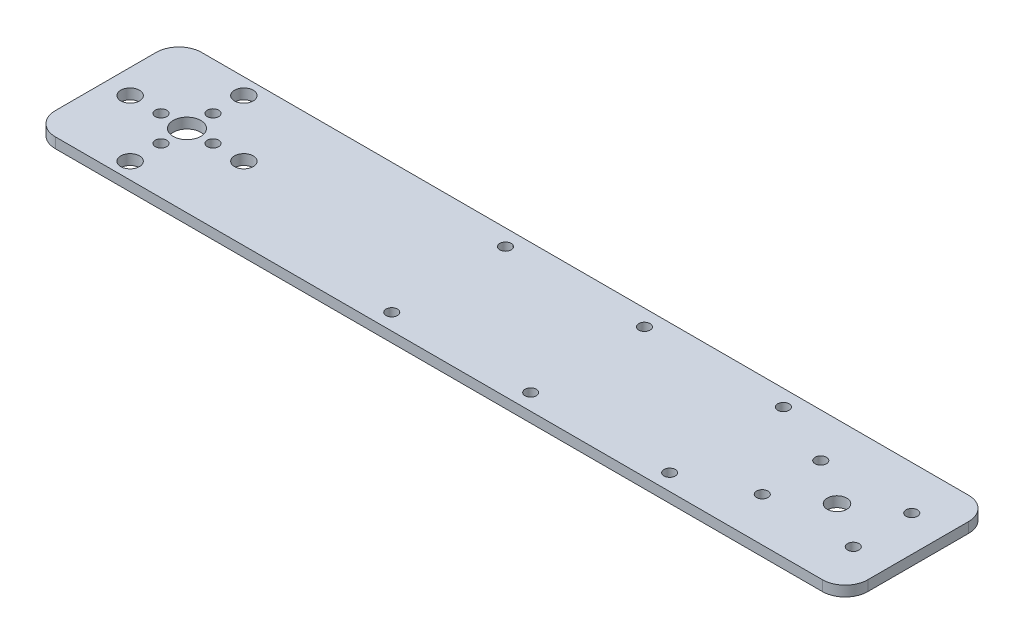
ISO-10303-21;
HEADER;
FILE_DESCRIPTION(('STEP AP214'),'2;1');
FILE_NAME('part.step','',(''),(''),'','','');
FILE_SCHEMA(('AUTOMOTIVE_DESIGN { 1 0 10303 214 1 1 1 1 }'));
ENDSEC;
DATA;
#1=APPLICATION_CONTEXT('core data for automotive mechanical design processes');
#2=APPLICATION_PROTOCOL_DEFINITION('international standard','automotive_design',2000,#1);
#3=PRODUCT_CONTEXT('',#1,'mechanical');
#4=PRODUCT('Part','Part','',(#3));
#5=PRODUCT_RELATED_PRODUCT_CATEGORY('part','',(#4));
#6=PRODUCT_DEFINITION_FORMATION('','',#4);
#7=PRODUCT_DEFINITION_CONTEXT('part definition',#1,'design');
#8=PRODUCT_DEFINITION('design','',#6,#7);
#9=PRODUCT_DEFINITION_SHAPE('','',#8);
#10=(LENGTH_UNIT() NAMED_UNIT(*) SI_UNIT(.MILLI.,.METRE.));
#11=(NAMED_UNIT(*) PLANE_ANGLE_UNIT() SI_UNIT($,.RADIAN.));
#12=(NAMED_UNIT(*) SI_UNIT($,.STERADIAN.) SOLID_ANGLE_UNIT());
#13=UNCERTAINTY_MEASURE_WITH_UNIT(LENGTH_MEASURE(1.E-05),#10,'distance_accuracy_value','');
#14=(GEOMETRIC_REPRESENTATION_CONTEXT(3) GLOBAL_UNCERTAINTY_ASSIGNED_CONTEXT((#13)) GLOBAL_UNIT_ASSIGNED_CONTEXT((#10,
#11,#12)) REPRESENTATION_CONTEXT('',''));
#15=CARTESIAN_POINT('',(0.,0.,0.));
#16=DIRECTION('',(0.,0.,1.));
#17=DIRECTION('',(1.,0.,0.));
#18=AXIS2_PLACEMENT_3D('',#15,#16,#17);
#19=CARTESIAN_POINT('',(-25.,3.175,-22.5));
#20=DIRECTION('',(1.,0.,0.));
#21=DIRECTION('',(0.,0.,-1.));
#22=AXIS2_PLACEMENT_3D('',#19,#20,#21);
#23=PLANE('',#22);
#24=DIRECTION('',(0.,0.,1.));
#25=VECTOR('',#24,1.);
#26=CARTESIAN_POINT('',(-25.,0.,-22.5));
#27=LINE('',#26,#25);
#28=CARTESIAN_POINT('',(-25.,0.,-15.5));
#29=VERTEX_POINT('',#28);
#30=CARTESIAN_POINT('',(-25.,0.,15.5));
#31=VERTEX_POINT('',#30);
#32=EDGE_CURVE('E132',#29,#31,#27,.T.);
#33=ORIENTED_EDGE('',*,*,#32,.T.);
#34=DIRECTION('',(0.,-1.,0.));
#35=VECTOR('',#34,1.);
#36=CARTESIAN_POINT('',(-25.,3.175,15.5));
#37=LINE('',#36,#35);
#38=CARTESIAN_POINT('',(-25.,3.175,15.5));
#39=VERTEX_POINT('',#38);
#40=EDGE_CURVE('E110',#31,#39,#37,.F.);
#41=ORIENTED_EDGE('',*,*,#40,.T.);
#42=DIRECTION('',(0.,0.,1.));
#43=VECTOR('',#42,1.);
#44=CARTESIAN_POINT('',(-25.,3.175,-22.5));
#45=LINE('',#44,#43);
#46=CARTESIAN_POINT('',(-25.,3.175,-15.5));
#47=VERTEX_POINT('',#46);
#48=EDGE_CURVE('E142',#47,#39,#45,.T.);
#49=ORIENTED_EDGE('',*,*,#48,.F.);
#50=DIRECTION('',(0.,-1.,0.));
#51=VECTOR('',#50,1.);
#52=CARTESIAN_POINT('',(-25.,3.175,-15.5));
#53=LINE('',#52,#51);
#54=EDGE_CURVE('E115',#47,#29,#53,.T.);
#55=ORIENTED_EDGE('',*,*,#54,.T.);
#56=EDGE_LOOP('',(#33,#41,#49,#55));
#57=FACE_BOUND('',#56,.T.);
#58=ADVANCED_FACE('F39',(#57),#23,.F.);
#59=CARTESIAN_POINT('',(-25.,3.175,22.5));
#60=DIRECTION('',(0.,0.,-1.));
#61=DIRECTION('',(-1.,0.,0.));
#62=AXIS2_PLACEMENT_3D('',#59,#60,#61);
#63=PLANE('',#62);
#64=DIRECTION('',(1.,0.,0.));
#65=VECTOR('',#64,1.);
#66=CARTESIAN_POINT('',(-25.,3.175,22.5));
#67=LINE('',#66,#65);
#68=CARTESIAN_POINT('',(-18.,3.175,22.5));
#69=VERTEX_POINT('',#68);
#70=CARTESIAN_POINT('',(218.,3.175,22.5));
#71=VERTEX_POINT('',#70);
#72=EDGE_CURVE('E125',#69,#71,#67,.T.);
#73=ORIENTED_EDGE('',*,*,#72,.F.);
#74=DIRECTION('',(0.,-1.,0.));
#75=VECTOR('',#74,1.);
#76=CARTESIAN_POINT('',(-18.,3.175,22.5));
#77=LINE('',#76,#75);
#78=CARTESIAN_POINT('',(-18.,0.,22.5));
#79=VERTEX_POINT('',#78);
#80=EDGE_CURVE('E109',#69,#79,#77,.T.);
#81=ORIENTED_EDGE('',*,*,#80,.T.);
#82=DIRECTION('',(1.,0.,0.));
#83=VECTOR('',#82,1.);
#84=CARTESIAN_POINT('',(-25.,0.,22.5));
#85=LINE('',#84,#83);
#86=CARTESIAN_POINT('',(218.,0.,22.5));
#87=VERTEX_POINT('',#86);
#88=EDGE_CURVE('E122',#79,#87,#85,.T.);
#89=ORIENTED_EDGE('',*,*,#88,.T.);
#90=DIRECTION('',(0.,-1.,0.));
#91=VECTOR('',#90,1.);
#92=CARTESIAN_POINT('',(218.,3.175,22.5));
#93=LINE('',#92,#91);
#94=EDGE_CURVE('E127',#87,#71,#93,.F.);
#95=ORIENTED_EDGE('',*,*,#94,.T.);
#96=EDGE_LOOP('',(#73,#81,#89,#95));
#97=FACE_BOUND('',#96,.T.);
#98=ADVANCED_FACE('F121',(#97),#63,.F.);
#99=CARTESIAN_POINT('',(225.,3.175,-22.5));
#100=DIRECTION('',(-1.,0.,0.));
#101=DIRECTION('',(0.,0.,1.));
#102=AXIS2_PLACEMENT_3D('',#99,#100,#101);
#103=PLANE('',#102);
#104=DIRECTION('',(0.,0.,-1.));
#105=VECTOR('',#104,1.);
#106=CARTESIAN_POINT('',(225.,0.,-22.5));
#107=LINE('',#106,#105);
#108=CARTESIAN_POINT('',(225.,0.,15.5));
#109=VERTEX_POINT('',#108);
#110=CARTESIAN_POINT('',(225.,0.,-15.5));
#111=VERTEX_POINT('',#110);
#112=EDGE_CURVE('E131',#109,#111,#107,.T.);
#113=ORIENTED_EDGE('',*,*,#112,.T.);
#114=DIRECTION('',(0.,-1.,0.));
#115=VECTOR('',#114,1.);
#116=CARTESIAN_POINT('',(225.,3.175,-15.5));
#117=LINE('',#116,#115);
#118=CARTESIAN_POINT('',(225.,3.175,-15.5));
#119=VERTEX_POINT('',#118);
#120=EDGE_CURVE('E11',#111,#119,#117,.F.);
#121=ORIENTED_EDGE('',*,*,#120,.T.);
#122=DIRECTION('',(0.,0.,-1.));
#123=VECTOR('',#122,1.);
#124=CARTESIAN_POINT('',(225.,3.175,-22.5));
#125=LINE('',#124,#123);
#126=CARTESIAN_POINT('',(225.,3.175,15.5));
#127=VERTEX_POINT('',#126);
#128=EDGE_CURVE('E168',#127,#119,#125,.T.);
#129=ORIENTED_EDGE('',*,*,#128,.F.);
#130=DIRECTION('',(0.,-1.,0.));
#131=VECTOR('',#130,1.);
#132=CARTESIAN_POINT('',(225.,3.175,15.5));
#133=LINE('',#132,#131);
#134=EDGE_CURVE('E47',#127,#109,#133,.T.);
#135=ORIENTED_EDGE('',*,*,#134,.T.);
#136=EDGE_LOOP('',(#113,#121,#129,#135));
#137=FACE_BOUND('',#136,.T.);
#138=ADVANCED_FACE('F166',(#137),#103,.F.);
#139=CARTESIAN_POINT('',(-25.,3.175,-22.5));
#140=DIRECTION('',(0.,0.,1.));
#141=DIRECTION('',(1.,0.,0.));
#142=AXIS2_PLACEMENT_3D('',#139,#140,#141);
#143=PLANE('',#142);
#144=DIRECTION('',(-1.,0.,0.));
#145=VECTOR('',#144,1.);
#146=CARTESIAN_POINT('',(-25.,0.,-22.5));
#147=LINE('',#146,#145);
#148=CARTESIAN_POINT('',(218.,0.,-22.5));
#149=VERTEX_POINT('',#148);
#150=CARTESIAN_POINT('',(-18.,0.,-22.5));
#151=VERTEX_POINT('',#150);
#152=EDGE_CURVE('E135',#149,#151,#147,.T.);
#153=ORIENTED_EDGE('',*,*,#152,.T.);
#154=DIRECTION('',(0.,-1.,0.));
#155=VECTOR('',#154,1.);
#156=CARTESIAN_POINT('',(-18.,3.175,-22.5));
#157=LINE('',#156,#155);
#158=CARTESIAN_POINT('',(-18.,3.175,-22.5));
#159=VERTEX_POINT('',#158);
#160=EDGE_CURVE('E54',#151,#159,#157,.F.);
#161=ORIENTED_EDGE('',*,*,#160,.T.);
#162=DIRECTION('',(-1.,0.,0.));
#163=VECTOR('',#162,1.);
#164=CARTESIAN_POINT('',(-25.,3.175,-22.5));
#165=LINE('',#164,#163);
#166=CARTESIAN_POINT('',(218.,3.175,-22.5));
#167=VERTEX_POINT('',#166);
#168=EDGE_CURVE('E143',#167,#159,#165,.T.);
#169=ORIENTED_EDGE('',*,*,#168,.F.);
#170=DIRECTION('',(0.,-1.,0.));
#171=VECTOR('',#170,1.);
#172=CARTESIAN_POINT('',(218.,3.175,-22.5));
#173=LINE('',#172,#171);
#174=EDGE_CURVE('E159',#167,#149,#173,.T.);
#175=ORIENTED_EDGE('',*,*,#174,.T.);
#176=EDGE_LOOP('',(#153,#161,#169,#175));
#177=FACE_BOUND('',#176,.T.);
#178=ADVANCED_FACE('F175',(#177),#143,.F.);
#179=CARTESIAN_POINT('',(0.,3.175,0.));
#180=DIRECTION('',(0.,1.,0.));
#181=DIRECTION('',(0.,0.,1.));
#182=AXIS2_PLACEMENT_3D('',#179,#180,#181);
#183=PLANE('',#182);
#184=CARTESIAN_POINT('',(0.,3.175,-8.));
#185=DIRECTION('',(0.,1.,0.));
#186=DIRECTION('',(0.,0.,1.));
#187=AXIS2_PLACEMENT_3D('',#184,#185,#186);
#188=CIRCLE('',#187,1.75);
#189=CARTESIAN_POINT('',(0.,3.175,-6.25));
#190=VERTEX_POINT('',#189);
#191=EDGE_CURVE('E296',#190,#190,#188,.T.);
#192=ORIENTED_EDGE('',*,*,#191,.F.);
#193=EDGE_LOOP('',(#192));
#194=FACE_BOUND('',#193,.T.);
#195=CARTESIAN_POINT('',(8.00000000000012,3.175,0.));
#196=DIRECTION('',(0.,1.,0.));
#197=DIRECTION('',(0.,0.,1.));
#198=AXIS2_PLACEMENT_3D('',#195,#196,#197);
#199=CIRCLE('',#198,1.74999999999994);
#200=CARTESIAN_POINT('',(8.00000000000012,3.175,1.75));
#201=VERTEX_POINT('',#200);
#202=EDGE_CURVE('E290',#201,#201,#199,.T.);
#203=ORIENTED_EDGE('',*,*,#202,.F.);
#204=EDGE_LOOP('',(#203));
#205=FACE_BOUND('',#204,.T.);
#206=CARTESIAN_POINT('',(2.29963216268258E-13,3.175,8.00000000000011));
#207=DIRECTION('',(0.,1.,0.));
#208=DIRECTION('',(0.,0.,1.));
#209=AXIS2_PLACEMENT_3D('',#206,#207,#208);
#210=CIRCLE('',#209,1.75000000000024);
#211=CARTESIAN_POINT('',(2.29963216268258E-13,3.175,9.75000000000035));
#212=VERTEX_POINT('',#211);
#213=EDGE_CURVE('E284',#212,#212,#210,.T.);
#214=ORIENTED_EDGE('',*,*,#213,.F.);
#215=EDGE_LOOP('',(#214));
#216=FACE_BOUND('',#215,.T.);
#217=CARTESIAN_POINT('',(-7.99999999999977,3.175,0.));
#218=DIRECTION('',(0.,1.,0.));
#219=DIRECTION('',(0.,0.,1.));
#220=AXIS2_PLACEMENT_3D('',#217,#218,#219);
#221=CIRCLE('',#220,1.75000000000015);
#222=CARTESIAN_POINT('',(-7.99999999999977,3.175,1.75000000000015));
#223=VERTEX_POINT('',#222);
#224=EDGE_CURVE('E278',#223,#223,#221,.T.);
#225=ORIENTED_EDGE('',*,*,#224,.F.);
#226=EDGE_LOOP('',(#225));
#227=FACE_BOUND('',#226,.T.);
#228=CARTESIAN_POINT('',(0.,3.175,-17.5));
#229=DIRECTION('',(0.,1.,0.));
#230=DIRECTION('',(0.,0.,1.));
#231=AXIS2_PLACEMENT_3D('',#228,#229,#230);
#232=CIRCLE('',#231,2.875);
#233=CARTESIAN_POINT('',(0.,3.175,-14.625));
#234=VERTEX_POINT('',#233);
#235=EDGE_CURVE('E273',#234,#234,#232,.T.);
#236=ORIENTED_EDGE('',*,*,#235,.F.);
#237=EDGE_LOOP('',(#236));
#238=FACE_BOUND('',#237,.T.);
#239=CARTESIAN_POINT('',(17.5,3.175,0.));
#240=DIRECTION('',(0.,1.,0.));
#241=DIRECTION('',(0.,0.,1.));
#242=AXIS2_PLACEMENT_3D('',#239,#240,#241);
#243=CIRCLE('',#242,2.875);
#244=CARTESIAN_POINT('',(17.5,3.175,2.87500000000006));
#245=VERTEX_POINT('',#244);
#246=EDGE_CURVE('E267',#245,#245,#243,.T.);
#247=ORIENTED_EDGE('',*,*,#246,.F.);
#248=EDGE_LOOP('',(#247));
#249=FACE_BOUND('',#248,.T.);
#250=CARTESIAN_POINT('',(-1.22814170259083E-13,3.175,17.5));
#251=DIRECTION('',(0.,1.,0.));
#252=DIRECTION('',(0.,0.,1.));
#253=AXIS2_PLACEMENT_3D('',#250,#251,#252);
#254=CIRCLE('',#253,2.875);
#255=CARTESIAN_POINT('',(-1.22814170259083E-13,3.175,20.375));
#256=VERTEX_POINT('',#255);
#257=EDGE_CURVE('E261',#256,#256,#254,.T.);
#258=ORIENTED_EDGE('',*,*,#257,.F.);
#259=EDGE_LOOP('',(#258));
#260=FACE_BOUND('',#259,.T.);
#261=CARTESIAN_POINT('',(-17.5,3.175,-1.83915093688838E-13));
#262=DIRECTION('',(0.,1.,0.));
#263=DIRECTION('',(0.,0.,1.));
#264=AXIS2_PLACEMENT_3D('',#261,#262,#263);
#265=CIRCLE('',#264,2.875);
#266=CARTESIAN_POINT('',(-17.5,3.175,2.87499999999982));
#267=VERTEX_POINT('',#266);
#268=EDGE_CURVE('E254',#267,#267,#265,.T.);
#269=ORIENTED_EDGE('',*,*,#268,.F.);
#270=EDGE_LOOP('',(#269));
#271=FACE_BOUND('',#270,.T.);
#272=CARTESIAN_POINT('',(166.,3.175,17.5));
#273=DIRECTION('',(0.,1.,0.));
#274=DIRECTION('',(0.,0.,1.));
#275=AXIS2_PLACEMENT_3D('',#272,#273,#274);
#276=CIRCLE('',#275,1.75000000000001);
#277=CARTESIAN_POINT('',(166.,3.175,19.25));
#278=VERTEX_POINT('',#277);
#279=EDGE_CURVE('E243',#278,#278,#276,.T.);
#280=ORIENTED_EDGE('',*,*,#279,.F.);
#281=EDGE_LOOP('',(#280));
#282=FACE_BOUND('',#281,.T.);
#283=CARTESIAN_POINT('',(166.,3.175,-17.5));
#284=DIRECTION('',(0.,1.,0.));
#285=DIRECTION('',(0.,0.,-1.));
#286=AXIS2_PLACEMENT_3D('',#283,#284,#285);
#287=CIRCLE('',#286,1.75000000000001);
#288=CARTESIAN_POINT('',(166.,3.175,-19.25));
#289=VERTEX_POINT('',#288);
#290=EDGE_CURVE('E237',#289,#289,#287,.T.);
#291=ORIENTED_EDGE('',*,*,#290,.F.);
#292=EDGE_LOOP('',(#291));
#293=FACE_BOUND('',#292,.T.);
#294=CARTESIAN_POINT('',(80.5,3.175,-17.5));
#295=DIRECTION('',(0.,1.,0.));
#296=DIRECTION('',(0.,0.,-1.));
#297=AXIS2_PLACEMENT_3D('',#294,#295,#296);
#298=CIRCLE('',#297,1.75);
#299=CARTESIAN_POINT('',(80.5,3.175,-19.25));
#300=VERTEX_POINT('',#299);
#301=EDGE_CURVE('E231',#300,#300,#298,.T.);
#302=ORIENTED_EDGE('',*,*,#301,.F.);
#303=EDGE_LOOP('',(#302));
#304=FACE_BOUND('',#303,.T.);
#305=CARTESIAN_POINT('',(123.25,3.175,17.5));
#306=DIRECTION('',(0.,1.,0.));
#307=DIRECTION('',(0.,0.,1.));
#308=AXIS2_PLACEMENT_3D('',#305,#306,#307);
#309=CIRCLE('',#308,1.75);
#310=CARTESIAN_POINT('',(123.25,3.175,19.25));
#311=VERTEX_POINT('',#310);
#312=EDGE_CURVE('E224',#311,#311,#309,.T.);
#313=ORIENTED_EDGE('',*,*,#312,.F.);
#314=EDGE_LOOP('',(#313));
#315=FACE_BOUND('',#314,.T.);
#316=CARTESIAN_POINT('',(123.25,3.175,-17.5));
#317=DIRECTION('',(0.,1.,0.));
#318=DIRECTION('',(0.,0.,-1.));
#319=AXIS2_PLACEMENT_3D('',#316,#317,#318);
#320=CIRCLE('',#319,1.75);
#321=CARTESIAN_POINT('',(123.25,3.175,-19.25));
#322=VERTEX_POINT('',#321);
#323=EDGE_CURVE('E248',#322,#322,#320,.T.);
#324=ORIENTED_EDGE('',*,*,#323,.F.);
#325=EDGE_LOOP('',(#324));
#326=FACE_BOUND('',#325,.T.);
#327=CARTESIAN_POINT('',(80.5,3.175,17.5));
#328=DIRECTION('',(0.,1.,0.));
#329=DIRECTION('',(0.,0.,1.));
#330=AXIS2_PLACEMENT_3D('',#327,#328,#329);
#331=CIRCLE('',#330,1.75);
#332=CARTESIAN_POINT('',(80.5,3.175,19.25));
#333=VERTEX_POINT('',#332);
#334=EDGE_CURVE('E218',#333,#333,#331,.T.);
#335=ORIENTED_EDGE('',*,*,#334,.F.);
#336=EDGE_LOOP('',(#335));
#337=FACE_BOUND('',#336,.T.);
#338=CARTESIAN_POINT('',(0.,3.175,0.));
#339=DIRECTION('',(0.,1.,0.));
#340=DIRECTION('',(0.,0.,1.));
#341=AXIS2_PLACEMENT_3D('',#338,#339,#340);
#342=CIRCLE('',#341,4.25);
#343=CARTESIAN_POINT('',(0.,3.175,4.25));
#344=VERTEX_POINT('',#343);
#345=EDGE_CURVE('E212',#344,#344,#342,.T.);
#346=ORIENTED_EDGE('',*,*,#345,.F.);
#347=EDGE_LOOP('',(#346));
#348=FACE_BOUND('',#347,.T.);
#349=CARTESIAN_POINT('',(186.,3.175,9.));
#350=DIRECTION('',(0.,1.,0.));
#351=DIRECTION('',(0.,0.,-1.));
#352=AXIS2_PLACEMENT_3D('',#349,#350,#351);
#353=CIRCLE('',#352,1.75000000000001);
#354=CARTESIAN_POINT('',(186.,3.175,7.24999999999999));
#355=VERTEX_POINT('',#354);
#356=EDGE_CURVE('E188',#355,#355,#353,.T.);
#357=ORIENTED_EDGE('',*,*,#356,.F.);
#358=EDGE_LOOP('',(#357));
#359=FACE_BOUND('',#358,.T.);
#360=CARTESIAN_POINT('',(214.,3.175,8.99999999999999));
#361=DIRECTION('',(0.,1.,0.));
#362=DIRECTION('',(0.,0.,1.));
#363=AXIS2_PLACEMENT_3D('',#360,#361,#362);
#364=CIRCLE('',#363,1.75000000000001);
#365=CARTESIAN_POINT('',(214.,3.175,10.75));
#366=VERTEX_POINT('',#365);
#367=EDGE_CURVE('E195',#366,#366,#364,.T.);
#368=ORIENTED_EDGE('',*,*,#367,.F.);
#369=EDGE_LOOP('',(#368));
#370=FACE_BOUND('',#369,.T.);
#371=CARTESIAN_POINT('',(214.,3.175,-9.00000000000001));
#372=DIRECTION('',(0.,1.,0.));
#373=DIRECTION('',(0.,0.,-1.));
#374=AXIS2_PLACEMENT_3D('',#371,#372,#373);
#375=CIRCLE('',#374,1.75000000000001);
#376=CARTESIAN_POINT('',(214.,3.175,-10.75));
#377=VERTEX_POINT('',#376);
#378=EDGE_CURVE('E201',#377,#377,#375,.T.);
#379=ORIENTED_EDGE('',*,*,#378,.F.);
#380=EDGE_LOOP('',(#379));
#381=FACE_BOUND('',#380,.T.);
#382=CARTESIAN_POINT('',(186.,3.175,-9.));
#383=DIRECTION('',(0.,1.,0.));
#384=DIRECTION('',(0.,0.,1.));
#385=AXIS2_PLACEMENT_3D('',#382,#383,#384);
#386=CIRCLE('',#385,1.75000000000001);
#387=CARTESIAN_POINT('',(186.,3.175,-7.24999999999999));
#388=VERTEX_POINT('',#387);
#389=EDGE_CURVE('E207',#388,#388,#386,.T.);
#390=ORIENTED_EDGE('',*,*,#389,.F.);
#391=EDGE_LOOP('',(#390));
#392=FACE_BOUND('',#391,.T.);
#393=CARTESIAN_POINT('',(200.,3.175,0.));
#394=DIRECTION('',(0.,1.,0.));
#395=DIRECTION('',(0.,0.,1.));
#396=AXIS2_PLACEMENT_3D('',#393,#394,#395);
#397=CIRCLE('',#396,2.99999999999999);
#398=CARTESIAN_POINT('',(200.,3.175,2.99999999999999));
#399=VERTEX_POINT('',#398);
#400=EDGE_CURVE('E182',#399,#399,#397,.T.);
#401=ORIENTED_EDGE('',*,*,#400,.F.);
#402=EDGE_LOOP('',(#401));
#403=FACE_BOUND('',#402,.T.);
#404=ORIENTED_EDGE('',*,*,#48,.T.);
#405=CARTESIAN_POINT('',(-18.,3.175,15.5));
#406=DIRECTION('',(0.,1.,0.));
#407=DIRECTION('',(0.,0.,1.));
#408=AXIS2_PLACEMENT_3D('',#405,#406,#407);
#409=CIRCLE('',#408,7.);
#410=EDGE_CURVE('E157',#39,#69,#409,.T.);
#411=ORIENTED_EDGE('',*,*,#410,.T.);
#412=ORIENTED_EDGE('',*,*,#72,.T.);
#413=CARTESIAN_POINT('',(218.,3.175,15.5));
#414=DIRECTION('',(0.,1.,0.));
#415=DIRECTION('',(0.,0.,1.));
#416=AXIS2_PLACEMENT_3D('',#413,#414,#415);
#417=CIRCLE('',#416,7.);
#418=EDGE_CURVE('E152',#71,#127,#417,.T.);
#419=ORIENTED_EDGE('',*,*,#418,.T.);
#420=ORIENTED_EDGE('',*,*,#128,.T.);
#421=CARTESIAN_POINT('',(218.,3.175,-15.5));
#422=DIRECTION('',(0.,1.,0.));
#423=DIRECTION('',(0.,0.,1.));
#424=AXIS2_PLACEMENT_3D('',#421,#422,#423);
#425=CIRCLE('',#424,7.);
#426=EDGE_CURVE('E61',#119,#167,#425,.T.);
#427=ORIENTED_EDGE('',*,*,#426,.T.);
#428=ORIENTED_EDGE('',*,*,#168,.T.);
#429=CARTESIAN_POINT('',(-18.,3.175,-15.5));
#430=DIRECTION('',(0.,1.,0.));
#431=DIRECTION('',(0.,0.,1.));
#432=AXIS2_PLACEMENT_3D('',#429,#430,#431);
#433=CIRCLE('',#432,7.);
#434=EDGE_CURVE('E155',#159,#47,#433,.T.);
#435=ORIENTED_EDGE('',*,*,#434,.T.);
#436=EDGE_LOOP('',(#404,#411,#412,#419,#420,#427,#428,#435));
#437=FACE_BOUND('',#436,.T.);
#438=ADVANCED_FACE('F311',(#194,#205,#216,#227,#238,#249,#260,#271,#282,#293,#304,#315,#326,
#337,#348,#359,#370,#381,#392,#403,#437),#183,.T.);
#439=CARTESIAN_POINT('',(0.,0.,0.));
#440=DIRECTION('',(0.,1.,0.));
#441=DIRECTION('',(0.,0.,1.));
#442=AXIS2_PLACEMENT_3D('',#439,#440,#441);
#443=PLANE('',#442);
#444=CARTESIAN_POINT('',(0.,0.,-8.));
#445=DIRECTION('',(0.,1.,0.));
#446=DIRECTION('',(0.,0.,1.));
#447=AXIS2_PLACEMENT_3D('',#444,#445,#446);
#448=CIRCLE('',#447,1.75);
#449=CARTESIAN_POINT('',(0.,0.,-6.25));
#450=VERTEX_POINT('',#449);
#451=EDGE_CURVE('E258',#450,#450,#448,.T.);
#452=ORIENTED_EDGE('',*,*,#451,.T.);
#453=EDGE_LOOP('',(#452));
#454=FACE_BOUND('',#453,.T.);
#455=CARTESIAN_POINT('',(8.00000000000012,0.,0.));
#456=DIRECTION('',(0.,1.,0.));
#457=DIRECTION('',(0.,0.,1.));
#458=AXIS2_PLACEMENT_3D('',#455,#456,#457);
#459=CIRCLE('',#458,1.74999999999994);
#460=CARTESIAN_POINT('',(8.00000000000012,0.,1.75));
#461=VERTEX_POINT('',#460);
#462=EDGE_CURVE('E293',#461,#461,#459,.T.);
#463=ORIENTED_EDGE('',*,*,#462,.T.);
#464=EDGE_LOOP('',(#463));
#465=FACE_BOUND('',#464,.T.);
#466=CARTESIAN_POINT('',(2.29963216268258E-13,0.,8.00000000000011));
#467=DIRECTION('',(0.,1.,0.));
#468=DIRECTION('',(0.,0.,1.));
#469=AXIS2_PLACEMENT_3D('',#466,#467,#468);
#470=CIRCLE('',#469,1.75000000000024);
#471=CARTESIAN_POINT('',(2.29963216268258E-13,0.,9.75000000000035));
#472=VERTEX_POINT('',#471);
#473=EDGE_CURVE('E287',#472,#472,#470,.T.);
#474=ORIENTED_EDGE('',*,*,#473,.T.);
#475=EDGE_LOOP('',(#474));
#476=FACE_BOUND('',#475,.T.);
#477=CARTESIAN_POINT('',(-7.99999999999977,0.,0.));
#478=DIRECTION('',(0.,1.,0.));
#479=DIRECTION('',(0.,0.,1.));
#480=AXIS2_PLACEMENT_3D('',#477,#478,#479);
#481=CIRCLE('',#480,1.75000000000015);
#482=CARTESIAN_POINT('',(-7.99999999999977,0.,1.75000000000015));
#483=VERTEX_POINT('',#482);
#484=EDGE_CURVE('E281',#483,#483,#481,.T.);
#485=ORIENTED_EDGE('',*,*,#484,.T.);
#486=EDGE_LOOP('',(#485));
#487=FACE_BOUND('',#486,.T.);
#488=CARTESIAN_POINT('',(0.,0.,-17.5));
#489=DIRECTION('',(0.,1.,0.));
#490=DIRECTION('',(0.,0.,1.));
#491=AXIS2_PLACEMENT_3D('',#488,#489,#490);
#492=CIRCLE('',#491,2.875);
#493=CARTESIAN_POINT('',(0.,0.,-14.625));
#494=VERTEX_POINT('',#493);
#495=EDGE_CURVE('E251',#494,#494,#492,.T.);
#496=ORIENTED_EDGE('',*,*,#495,.T.);
#497=EDGE_LOOP('',(#496));
#498=FACE_BOUND('',#497,.T.);
#499=CARTESIAN_POINT('',(17.5,0.,0.));
#500=DIRECTION('',(0.,1.,0.));
#501=DIRECTION('',(0.,0.,1.));
#502=AXIS2_PLACEMENT_3D('',#499,#500,#501);
#503=CIRCLE('',#502,2.875);
#504=CARTESIAN_POINT('',(17.5,0.,2.87500000000006));
#505=VERTEX_POINT('',#504);
#506=EDGE_CURVE('E270',#505,#505,#503,.T.);
#507=ORIENTED_EDGE('',*,*,#506,.T.);
#508=EDGE_LOOP('',(#507));
#509=FACE_BOUND('',#508,.T.);
#510=CARTESIAN_POINT('',(-1.22814170259083E-13,0.,17.5));
#511=DIRECTION('',(0.,1.,0.));
#512=DIRECTION('',(0.,0.,1.));
#513=AXIS2_PLACEMENT_3D('',#510,#511,#512);
#514=CIRCLE('',#513,2.875);
#515=CARTESIAN_POINT('',(-1.22814170259083E-13,0.,20.375));
#516=VERTEX_POINT('',#515);
#517=EDGE_CURVE('E264',#516,#516,#514,.T.);
#518=ORIENTED_EDGE('',*,*,#517,.T.);
#519=EDGE_LOOP('',(#518));
#520=FACE_BOUND('',#519,.T.);
#521=CARTESIAN_POINT('',(-17.5,0.,-1.83915093688838E-13));
#522=DIRECTION('',(0.,1.,0.));
#523=DIRECTION('',(0.,0.,1.));
#524=AXIS2_PLACEMENT_3D('',#521,#522,#523);
#525=CIRCLE('',#524,2.875);
#526=CARTESIAN_POINT('',(-17.5,0.,2.87499999999982));
#527=VERTEX_POINT('',#526);
#528=EDGE_CURVE('E257',#527,#527,#525,.T.);
#529=ORIENTED_EDGE('',*,*,#528,.T.);
#530=EDGE_LOOP('',(#529));
#531=FACE_BOUND('',#530,.T.);
#532=CARTESIAN_POINT('',(166.,0.,17.5));
#533=DIRECTION('',(0.,1.,0.));
#534=DIRECTION('',(0.,0.,1.));
#535=AXIS2_PLACEMENT_3D('',#532,#533,#534);
#536=CIRCLE('',#535,1.75000000000001);
#537=CARTESIAN_POINT('',(166.,0.,19.25));
#538=VERTEX_POINT('',#537);
#539=EDGE_CURVE('E221',#538,#538,#536,.T.);
#540=ORIENTED_EDGE('',*,*,#539,.T.);
#541=EDGE_LOOP('',(#540));
#542=FACE_BOUND('',#541,.T.);
#543=CARTESIAN_POINT('',(166.,0.,-17.5));
#544=DIRECTION('',(0.,1.,0.));
#545=DIRECTION('',(0.,0.,-1.));
#546=AXIS2_PLACEMENT_3D('',#543,#544,#545);
#547=CIRCLE('',#546,1.75000000000001);
#548=CARTESIAN_POINT('',(166.,0.,-19.25));
#549=VERTEX_POINT('',#548);
#550=EDGE_CURVE('E240',#549,#549,#547,.T.);
#551=ORIENTED_EDGE('',*,*,#550,.T.);
#552=EDGE_LOOP('',(#551));
#553=FACE_BOUND('',#552,.T.);
#554=CARTESIAN_POINT('',(80.5,0.,-17.5));
#555=DIRECTION('',(0.,1.,0.));
#556=DIRECTION('',(0.,0.,-1.));
#557=AXIS2_PLACEMENT_3D('',#554,#555,#556);
#558=CIRCLE('',#557,1.75);
#559=CARTESIAN_POINT('',(80.5,0.,-19.25));
#560=VERTEX_POINT('',#559);
#561=EDGE_CURVE('E234',#560,#560,#558,.T.);
#562=ORIENTED_EDGE('',*,*,#561,.T.);
#563=EDGE_LOOP('',(#562));
#564=FACE_BOUND('',#563,.T.);
#565=CARTESIAN_POINT('',(123.25,0.,17.5));
#566=DIRECTION('',(0.,1.,0.));
#567=DIRECTION('',(0.,0.,1.));
#568=AXIS2_PLACEMENT_3D('',#565,#566,#567);
#569=CIRCLE('',#568,1.75);
#570=CARTESIAN_POINT('',(123.25,0.,19.25));
#571=VERTEX_POINT('',#570);
#572=EDGE_CURVE('E227',#571,#571,#569,.T.);
#573=ORIENTED_EDGE('',*,*,#572,.T.);
#574=EDGE_LOOP('',(#573));
#575=FACE_BOUND('',#574,.T.);
#576=CARTESIAN_POINT('',(123.25,0.,-17.5));
#577=DIRECTION('',(0.,1.,0.));
#578=DIRECTION('',(0.,0.,-1.));
#579=AXIS2_PLACEMENT_3D('',#576,#577,#578);
#580=CIRCLE('',#579,1.75);
#581=CARTESIAN_POINT('',(123.25,0.,-19.25));
#582=VERTEX_POINT('',#581);
#583=EDGE_CURVE('E228',#582,#582,#580,.T.);
#584=ORIENTED_EDGE('',*,*,#583,.T.);
#585=EDGE_LOOP('',(#584));
#586=FACE_BOUND('',#585,.T.);
#587=CARTESIAN_POINT('',(80.5,0.,17.5));
#588=DIRECTION('',(0.,1.,0.));
#589=DIRECTION('',(0.,0.,1.));
#590=AXIS2_PLACEMENT_3D('',#587,#588,#589);
#591=CIRCLE('',#590,1.75);
#592=CARTESIAN_POINT('',(80.5,0.,19.25));
#593=VERTEX_POINT('',#592);
#594=EDGE_CURVE('E215',#593,#593,#591,.T.);
#595=ORIENTED_EDGE('',*,*,#594,.T.);
#596=EDGE_LOOP('',(#595));
#597=FACE_BOUND('',#596,.T.);
#598=CARTESIAN_POINT('',(0.,0.,0.));
#599=DIRECTION('',(0.,1.,0.));
#600=DIRECTION('',(0.,0.,1.));
#601=AXIS2_PLACEMENT_3D('',#598,#599,#600);
#602=CIRCLE('',#601,4.25);
#603=CARTESIAN_POINT('',(0.,0.,4.25));
#604=VERTEX_POINT('',#603);
#605=EDGE_CURVE('E192',#604,#604,#602,.T.);
#606=ORIENTED_EDGE('',*,*,#605,.T.);
#607=EDGE_LOOP('',(#606));
#608=FACE_BOUND('',#607,.T.);
#609=CARTESIAN_POINT('',(186.,0.,9.));
#610=DIRECTION('',(0.,1.,0.));
#611=DIRECTION('',(0.,0.,-1.));
#612=AXIS2_PLACEMENT_3D('',#609,#610,#611);
#613=CIRCLE('',#612,1.75000000000001);
#614=CARTESIAN_POINT('',(186.,0.,7.24999999999999));
#615=VERTEX_POINT('',#614);
#616=EDGE_CURVE('E191',#615,#615,#613,.T.);
#617=ORIENTED_EDGE('',*,*,#616,.T.);
#618=EDGE_LOOP('',(#617));
#619=FACE_BOUND('',#618,.T.);
#620=CARTESIAN_POINT('',(214.,0.,8.99999999999999));
#621=DIRECTION('',(0.,1.,0.));
#622=DIRECTION('',(0.,0.,1.));
#623=AXIS2_PLACEMENT_3D('',#620,#621,#622);
#624=CIRCLE('',#623,1.75000000000001);
#625=CARTESIAN_POINT('',(214.,0.,10.75));
#626=VERTEX_POINT('',#625);
#627=EDGE_CURVE('E198',#626,#626,#624,.T.);
#628=ORIENTED_EDGE('',*,*,#627,.T.);
#629=EDGE_LOOP('',(#628));
#630=FACE_BOUND('',#629,.T.);
#631=CARTESIAN_POINT('',(214.,0.,-9.00000000000001));
#632=DIRECTION('',(0.,1.,0.));
#633=DIRECTION('',(0.,0.,-1.));
#634=AXIS2_PLACEMENT_3D('',#631,#632,#633);
#635=CIRCLE('',#634,1.75000000000001);
#636=CARTESIAN_POINT('',(214.,0.,-10.75));
#637=VERTEX_POINT('',#636);
#638=EDGE_CURVE('E204',#637,#637,#635,.T.);
#639=ORIENTED_EDGE('',*,*,#638,.T.);
#640=EDGE_LOOP('',(#639));
#641=FACE_BOUND('',#640,.T.);
#642=CARTESIAN_POINT('',(186.,0.,-9.));
#643=DIRECTION('',(0.,1.,0.));
#644=DIRECTION('',(0.,0.,1.));
#645=AXIS2_PLACEMENT_3D('',#642,#643,#644);
#646=CIRCLE('',#645,1.75000000000001);
#647=CARTESIAN_POINT('',(186.,0.,-7.24999999999999));
#648=VERTEX_POINT('',#647);
#649=EDGE_CURVE('E185',#648,#648,#646,.T.);
#650=ORIENTED_EDGE('',*,*,#649,.T.);
#651=EDGE_LOOP('',(#650));
#652=FACE_BOUND('',#651,.T.);
#653=CARTESIAN_POINT('',(200.,0.,0.));
#654=DIRECTION('',(0.,1.,0.));
#655=DIRECTION('',(0.,0.,1.));
#656=AXIS2_PLACEMENT_3D('',#653,#654,#655);
#657=CIRCLE('',#656,2.99999999999999);
#658=CARTESIAN_POINT('',(200.,0.,2.99999999999999));
#659=VERTEX_POINT('',#658);
#660=EDGE_CURVE('E137',#659,#659,#657,.T.);
#661=ORIENTED_EDGE('',*,*,#660,.T.);
#662=EDGE_LOOP('',(#661));
#663=FACE_BOUND('',#662,.T.);
#664=ORIENTED_EDGE('',*,*,#88,.F.);
#665=CARTESIAN_POINT('',(-18.,0.,15.5));
#666=DIRECTION('',(0.,1.,0.));
#667=DIRECTION('',(0.,0.,1.));
#668=AXIS2_PLACEMENT_3D('',#665,#666,#667);
#669=CIRCLE('',#668,7.);
#670=EDGE_CURVE('E105',#79,#31,#669,.F.);
#671=ORIENTED_EDGE('',*,*,#670,.T.);
#672=ORIENTED_EDGE('',*,*,#32,.F.);
#673=CARTESIAN_POINT('',(-18.,0.,-15.5));
#674=DIRECTION('',(0.,1.,0.));
#675=DIRECTION('',(0.,0.,1.));
#676=AXIS2_PLACEMENT_3D('',#673,#674,#675);
#677=CIRCLE('',#676,7.);
#678=EDGE_CURVE('E116',#29,#151,#677,.F.);
#679=ORIENTED_EDGE('',*,*,#678,.T.);
#680=ORIENTED_EDGE('',*,*,#152,.F.);
#681=CARTESIAN_POINT('',(218.,0.,-15.5));
#682=DIRECTION('',(0.,1.,0.));
#683=DIRECTION('',(0.,0.,1.));
#684=AXIS2_PLACEMENT_3D('',#681,#682,#683);
#685=CIRCLE('',#684,7.);
#686=EDGE_CURVE('E146',#149,#111,#685,.F.);
#687=ORIENTED_EDGE('',*,*,#686,.T.);
#688=ORIENTED_EDGE('',*,*,#112,.F.);
#689=CARTESIAN_POINT('',(218.,0.,15.5));
#690=DIRECTION('',(0.,1.,0.));
#691=DIRECTION('',(0.,0.,1.));
#692=AXIS2_PLACEMENT_3D('',#689,#690,#691);
#693=CIRCLE('',#692,7.);
#694=EDGE_CURVE('E126',#109,#87,#693,.F.);
#695=ORIENTED_EDGE('',*,*,#694,.T.);
#696=EDGE_LOOP('',(#664,#671,#672,#679,#680,#687,#688,#695));
#697=FACE_BOUND('',#696,.T.);
#698=ADVANCED_FACE('F129',(#454,#465,#476,#487,#498,#509,#520,#531,#542,#553,#564,#575,#586,
#597,#608,#619,#630,#641,#652,#663,#697),#443,.F.);
#699=CARTESIAN_POINT('',(200.,0.,0.));
#700=DIRECTION('',(0.,1.,0.));
#701=DIRECTION('',(0.,0.,1.));
#702=AXIS2_PLACEMENT_3D('',#699,#700,#701);
#703=CYLINDRICAL_SURFACE('',#702,2.99999999999999);
#704=ORIENTED_EDGE('',*,*,#660,.F.);
#705=EDGE_LOOP('',(#704));
#706=FACE_BOUND('',#705,.T.);
#707=ORIENTED_EDGE('',*,*,#400,.T.);
#708=EDGE_LOOP('',(#707));
#709=FACE_BOUND('',#708,.T.);
#710=ADVANCED_FACE('F377',(#706,#709),#703,.F.);
#711=CARTESIAN_POINT('',(186.,0.,-9.));
#712=DIRECTION('',(0.,1.,0.));
#713=DIRECTION('',(0.,0.,1.));
#714=AXIS2_PLACEMENT_3D('',#711,#712,#713);
#715=CYLINDRICAL_SURFACE('',#714,1.75000000000001);
#716=ORIENTED_EDGE('',*,*,#649,.F.);
#717=EDGE_LOOP('',(#716));
#718=FACE_BOUND('',#717,.T.);
#719=ORIENTED_EDGE('',*,*,#389,.T.);
#720=EDGE_LOOP('',(#719));
#721=FACE_BOUND('',#720,.T.);
#722=ADVANCED_FACE('F381',(#718,#721),#715,.F.);
#723=CARTESIAN_POINT('',(214.,0.,-9.00000000000001));
#724=DIRECTION('',(0.,1.,0.));
#725=DIRECTION('',(0.,0.,1.));
#726=AXIS2_PLACEMENT_3D('',#723,#724,#725);
#727=CYLINDRICAL_SURFACE('',#726,1.75000000000001);
#728=ORIENTED_EDGE('',*,*,#638,.F.);
#729=EDGE_LOOP('',(#728));
#730=FACE_BOUND('',#729,.T.);
#731=ORIENTED_EDGE('',*,*,#378,.T.);
#732=EDGE_LOOP('',(#731));
#733=FACE_BOUND('',#732,.T.);
#734=ADVANCED_FACE('F391',(#730,#733),#727,.F.);
#735=CARTESIAN_POINT('',(214.,0.,8.99999999999999));
#736=DIRECTION('',(0.,1.,0.));
#737=DIRECTION('',(0.,0.,1.));
#738=AXIS2_PLACEMENT_3D('',#735,#736,#737);
#739=CYLINDRICAL_SURFACE('',#738,1.75000000000001);
#740=ORIENTED_EDGE('',*,*,#627,.F.);
#741=EDGE_LOOP('',(#740));
#742=FACE_BOUND('',#741,.T.);
#743=ORIENTED_EDGE('',*,*,#367,.T.);
#744=EDGE_LOOP('',(#743));
#745=FACE_BOUND('',#744,.T.);
#746=ADVANCED_FACE('F387',(#742,#745),#739,.F.);
#747=CARTESIAN_POINT('',(186.,0.,9.));
#748=DIRECTION('',(0.,1.,0.));
#749=DIRECTION('',(0.,0.,1.));
#750=AXIS2_PLACEMENT_3D('',#747,#748,#749);
#751=CYLINDRICAL_SURFACE('',#750,1.75000000000001);
#752=ORIENTED_EDGE('',*,*,#616,.F.);
#753=EDGE_LOOP('',(#752));
#754=FACE_BOUND('',#753,.T.);
#755=ORIENTED_EDGE('',*,*,#356,.T.);
#756=EDGE_LOOP('',(#755));
#757=FACE_BOUND('',#756,.T.);
#758=ADVANCED_FACE('F383',(#754,#757),#751,.F.);
#759=CARTESIAN_POINT('',(0.,0.,0.));
#760=DIRECTION('',(0.,1.,0.));
#761=DIRECTION('',(0.,0.,1.));
#762=AXIS2_PLACEMENT_3D('',#759,#760,#761);
#763=CYLINDRICAL_SURFACE('',#762,4.25);
#764=ORIENTED_EDGE('',*,*,#605,.F.);
#765=EDGE_LOOP('',(#764));
#766=FACE_BOUND('',#765,.T.);
#767=ORIENTED_EDGE('',*,*,#345,.T.);
#768=EDGE_LOOP('',(#767));
#769=FACE_BOUND('',#768,.T.);
#770=ADVANCED_FACE('F386',(#766,#769),#763,.F.);
#771=CARTESIAN_POINT('',(80.5,0.,17.5));
#772=DIRECTION('',(0.,1.,0.));
#773=DIRECTION('',(0.,0.,1.));
#774=AXIS2_PLACEMENT_3D('',#771,#772,#773);
#775=CYLINDRICAL_SURFACE('',#774,1.75);
#776=ORIENTED_EDGE('',*,*,#594,.F.);
#777=EDGE_LOOP('',(#776));
#778=FACE_BOUND('',#777,.T.);
#779=ORIENTED_EDGE('',*,*,#334,.T.);
#780=EDGE_LOOP('',(#779));
#781=FACE_BOUND('',#780,.T.);
#782=ADVANCED_FACE('F401',(#778,#781),#775,.F.);
#783=CARTESIAN_POINT('',(123.25,0.,-17.5));
#784=DIRECTION('',(0.,1.,0.));
#785=DIRECTION('',(0.,0.,1.));
#786=AXIS2_PLACEMENT_3D('',#783,#784,#785);
#787=CYLINDRICAL_SURFACE('',#786,1.75);
#788=ORIENTED_EDGE('',*,*,#583,.F.);
#789=EDGE_LOOP('',(#788));
#790=FACE_BOUND('',#789,.T.);
#791=ORIENTED_EDGE('',*,*,#323,.T.);
#792=EDGE_LOOP('',(#791));
#793=FACE_BOUND('',#792,.T.);
#794=ADVANCED_FACE('F405',(#790,#793),#787,.F.);
#795=CARTESIAN_POINT('',(123.25,0.,17.5));
#796=DIRECTION('',(0.,1.,0.));
#797=DIRECTION('',(0.,0.,1.));
#798=AXIS2_PLACEMENT_3D('',#795,#796,#797);
#799=CYLINDRICAL_SURFACE('',#798,1.75);
#800=ORIENTED_EDGE('',*,*,#572,.F.);
#801=EDGE_LOOP('',(#800));
#802=FACE_BOUND('',#801,.T.);
#803=ORIENTED_EDGE('',*,*,#312,.T.);
#804=EDGE_LOOP('',(#803));
#805=FACE_BOUND('',#804,.T.);
#806=ADVANCED_FACE('F407',(#802,#805),#799,.F.);
#807=CARTESIAN_POINT('',(80.5,0.,-17.5));
#808=DIRECTION('',(0.,1.,0.));
#809=DIRECTION('',(0.,0.,1.));
#810=AXIS2_PLACEMENT_3D('',#807,#808,#809);
#811=CYLINDRICAL_SURFACE('',#810,1.75);
#812=ORIENTED_EDGE('',*,*,#561,.F.);
#813=EDGE_LOOP('',(#812));
#814=FACE_BOUND('',#813,.T.);
#815=ORIENTED_EDGE('',*,*,#301,.T.);
#816=EDGE_LOOP('',(#815));
#817=FACE_BOUND('',#816,.T.);
#818=ADVANCED_FACE('F410',(#814,#817),#811,.F.);
#819=CARTESIAN_POINT('',(166.,0.,-17.5));
#820=DIRECTION('',(0.,1.,0.));
#821=DIRECTION('',(0.,0.,1.));
#822=AXIS2_PLACEMENT_3D('',#819,#820,#821);
#823=CYLINDRICAL_SURFACE('',#822,1.75000000000001);
#824=ORIENTED_EDGE('',*,*,#550,.F.);
#825=EDGE_LOOP('',(#824));
#826=FACE_BOUND('',#825,.T.);
#827=ORIENTED_EDGE('',*,*,#290,.T.);
#828=EDGE_LOOP('',(#827));
#829=FACE_BOUND('',#828,.T.);
#830=ADVANCED_FACE('F414',(#826,#829),#823,.F.);
#831=CARTESIAN_POINT('',(166.,0.,17.5));
#832=DIRECTION('',(0.,1.,0.));
#833=DIRECTION('',(0.,0.,1.));
#834=AXIS2_PLACEMENT_3D('',#831,#832,#833);
#835=CYLINDRICAL_SURFACE('',#834,1.75000000000001);
#836=ORIENTED_EDGE('',*,*,#539,.F.);
#837=EDGE_LOOP('',(#836));
#838=FACE_BOUND('',#837,.T.);
#839=ORIENTED_EDGE('',*,*,#279,.T.);
#840=EDGE_LOOP('',(#839));
#841=FACE_BOUND('',#840,.T.);
#842=ADVANCED_FACE('F363',(#838,#841),#835,.F.);
#843=CARTESIAN_POINT('',(-18.,3.175,15.5));
#844=DIRECTION('',(0.,-1.,0.));
#845=DIRECTION('',(0.,0.,-1.));
#846=AXIS2_PLACEMENT_3D('',#843,#844,#845);
#847=CYLINDRICAL_SURFACE('',#846,7.);
#848=ORIENTED_EDGE('',*,*,#410,.F.);
#849=ORIENTED_EDGE('',*,*,#40,.F.);
#850=ORIENTED_EDGE('',*,*,#670,.F.);
#851=ORIENTED_EDGE('',*,*,#80,.F.);
#852=EDGE_LOOP('',(#848,#849,#850,#851));
#853=FACE_BOUND('',#852,.T.);
#854=ADVANCED_FACE('F108',(#853),#847,.T.);
#855=CARTESIAN_POINT('',(-18.,3.175,-15.5));
#856=DIRECTION('',(0.,-1.,0.));
#857=DIRECTION('',(0.,0.,-1.));
#858=AXIS2_PLACEMENT_3D('',#855,#856,#857);
#859=CYLINDRICAL_SURFACE('',#858,7.);
#860=ORIENTED_EDGE('',*,*,#434,.F.);
#861=ORIENTED_EDGE('',*,*,#160,.F.);
#862=ORIENTED_EDGE('',*,*,#678,.F.);
#863=ORIENTED_EDGE('',*,*,#54,.F.);
#864=EDGE_LOOP('',(#860,#861,#862,#863));
#865=FACE_BOUND('',#864,.T.);
#866=ADVANCED_FACE('F356',(#865),#859,.T.);
#867=CARTESIAN_POINT('',(218.,3.175,-15.5));
#868=DIRECTION('',(0.,-1.,0.));
#869=DIRECTION('',(0.,0.,-1.));
#870=AXIS2_PLACEMENT_3D('',#867,#868,#869);
#871=CYLINDRICAL_SURFACE('',#870,7.);
#872=ORIENTED_EDGE('',*,*,#426,.F.);
#873=ORIENTED_EDGE('',*,*,#120,.F.);
#874=ORIENTED_EDGE('',*,*,#686,.F.);
#875=ORIENTED_EDGE('',*,*,#174,.F.);
#876=EDGE_LOOP('',(#872,#873,#874,#875));
#877=FACE_BOUND('',#876,.T.);
#878=ADVANCED_FACE('F174',(#877),#871,.T.);
#879=CARTESIAN_POINT('',(218.,3.175,15.5));
#880=DIRECTION('',(0.,-1.,0.));
#881=DIRECTION('',(0.,0.,-1.));
#882=AXIS2_PLACEMENT_3D('',#879,#880,#881);
#883=CYLINDRICAL_SURFACE('',#882,7.);
#884=ORIENTED_EDGE('',*,*,#418,.F.);
#885=ORIENTED_EDGE('',*,*,#94,.F.);
#886=ORIENTED_EDGE('',*,*,#694,.F.);
#887=ORIENTED_EDGE('',*,*,#134,.F.);
#888=EDGE_LOOP('',(#884,#885,#886,#887));
#889=FACE_BOUND('',#888,.T.);
#890=ADVANCED_FACE('F41',(#889),#883,.T.);
#891=CARTESIAN_POINT('',(-17.5,0.,-1.83915093688838E-13));
#892=DIRECTION('',(0.,1.,0.));
#893=DIRECTION('',(0.,0.,1.));
#894=AXIS2_PLACEMENT_3D('',#891,#892,#893);
#895=CYLINDRICAL_SURFACE('',#894,2.875);
#896=ORIENTED_EDGE('',*,*,#528,.F.);
#897=EDGE_LOOP('',(#896));
#898=FACE_BOUND('',#897,.T.);
#899=ORIENTED_EDGE('',*,*,#268,.T.);
#900=EDGE_LOOP('',(#899));
#901=FACE_BOUND('',#900,.T.);
#902=ADVANCED_FACE('F425',(#898,#901),#895,.F.);
#903=CARTESIAN_POINT('',(-1.22814170259083E-13,0.,17.5));
#904=DIRECTION('',(0.,1.,0.));
#905=DIRECTION('',(0.,0.,1.));
#906=AXIS2_PLACEMENT_3D('',#903,#904,#905);
#907=CYLINDRICAL_SURFACE('',#906,2.875);
#908=ORIENTED_EDGE('',*,*,#517,.F.);
#909=EDGE_LOOP('',(#908));
#910=FACE_BOUND('',#909,.T.);
#911=ORIENTED_EDGE('',*,*,#257,.T.);
#912=EDGE_LOOP('',(#911));
#913=FACE_BOUND('',#912,.T.);
#914=ADVANCED_FACE('F428',(#910,#913),#907,.F.);
#915=CARTESIAN_POINT('',(17.5,0.,0.));
#916=DIRECTION('',(0.,1.,0.));
#917=DIRECTION('',(0.,0.,1.));
#918=AXIS2_PLACEMENT_3D('',#915,#916,#917);
#919=CYLINDRICAL_SURFACE('',#918,2.875);
#920=ORIENTED_EDGE('',*,*,#506,.F.);
#921=EDGE_LOOP('',(#920));
#922=FACE_BOUND('',#921,.T.);
#923=ORIENTED_EDGE('',*,*,#246,.T.);
#924=EDGE_LOOP('',(#923));
#925=FACE_BOUND('',#924,.T.);
#926=ADVANCED_FACE('F432',(#922,#925),#919,.F.);
#927=CARTESIAN_POINT('',(0.,0.,-17.5));
#928=DIRECTION('',(0.,1.,0.));
#929=DIRECTION('',(0.,0.,1.));
#930=AXIS2_PLACEMENT_3D('',#927,#928,#929);
#931=CYLINDRICAL_SURFACE('',#930,2.875);
#932=ORIENTED_EDGE('',*,*,#495,.F.);
#933=EDGE_LOOP('',(#932));
#934=FACE_BOUND('',#933,.T.);
#935=ORIENTED_EDGE('',*,*,#235,.T.);
#936=EDGE_LOOP('',(#935));
#937=FACE_BOUND('',#936,.T.);
#938=ADVANCED_FACE('F436',(#934,#937),#931,.F.);
#939=CARTESIAN_POINT('',(-7.99999999999977,0.,0.));
#940=DIRECTION('',(0.,1.,0.));
#941=DIRECTION('',(0.,0.,1.));
#942=AXIS2_PLACEMENT_3D('',#939,#940,#941);
#943=CYLINDRICAL_SURFACE('',#942,1.75000000000015);
#944=ORIENTED_EDGE('',*,*,#484,.F.);
#945=EDGE_LOOP('',(#944));
#946=FACE_BOUND('',#945,.T.);
#947=ORIENTED_EDGE('',*,*,#224,.T.);
#948=EDGE_LOOP('',(#947));
#949=FACE_BOUND('',#948,.T.);
#950=ADVANCED_FACE('F440',(#946,#949),#943,.F.);
#951=CARTESIAN_POINT('',(2.29963216268258E-13,0.,8.00000000000011));
#952=DIRECTION('',(0.,1.,0.));
#953=DIRECTION('',(0.,0.,1.));
#954=AXIS2_PLACEMENT_3D('',#951,#952,#953);
#955=CYLINDRICAL_SURFACE('',#954,1.75000000000024);
#956=ORIENTED_EDGE('',*,*,#473,.F.);
#957=EDGE_LOOP('',(#956));
#958=FACE_BOUND('',#957,.T.);
#959=ORIENTED_EDGE('',*,*,#213,.T.);
#960=EDGE_LOOP('',(#959));
#961=FACE_BOUND('',#960,.T.);
#962=ADVANCED_FACE('F444',(#958,#961),#955,.F.);
#963=CARTESIAN_POINT('',(8.00000000000012,0.,0.));
#964=DIRECTION('',(0.,1.,0.));
#965=DIRECTION('',(0.,0.,1.));
#966=AXIS2_PLACEMENT_3D('',#963,#964,#965);
#967=CYLINDRICAL_SURFACE('',#966,1.74999999999994);
#968=ORIENTED_EDGE('',*,*,#462,.F.);
#969=EDGE_LOOP('',(#968));
#970=FACE_BOUND('',#969,.T.);
#971=ORIENTED_EDGE('',*,*,#202,.T.);
#972=EDGE_LOOP('',(#971));
#973=FACE_BOUND('',#972,.T.);
#974=ADVANCED_FACE('F307',(#970,#973),#967,.F.);
#975=CARTESIAN_POINT('',(0.,0.,-8.));
#976=DIRECTION('',(0.,1.,0.));
#977=DIRECTION('',(0.,0.,1.));
#978=AXIS2_PLACEMENT_3D('',#975,#976,#977);
#979=CYLINDRICAL_SURFACE('',#978,1.75);
#980=ORIENTED_EDGE('',*,*,#451,.F.);
#981=EDGE_LOOP('',(#980));
#982=FACE_BOUND('',#981,.T.);
#983=ORIENTED_EDGE('',*,*,#191,.T.);
#984=EDGE_LOOP('',(#983));
#985=FACE_BOUND('',#984,.T.);
#986=ADVANCED_FACE('F304',(#982,#985),#979,.F.);
#987=CLOSED_SHELL('',(#58,#98,#138,#178,#438,#698,#710,#722,#734,#746,#758,#770,#782,#794,#806,
#818,#830,#842,#854,#866,#878,#890,#902,#914,#926,#938,#950,#962,#974,#986));
#988=MANIFOLD_SOLID_BREP('B2',#987);
#989=ADVANCED_BREP_SHAPE_REPRESENTATION('',(#18,#988),#14);
#990=SHAPE_DEFINITION_REPRESENTATION(#9,#989);
ENDSEC;
END-ISO-10303-21;
